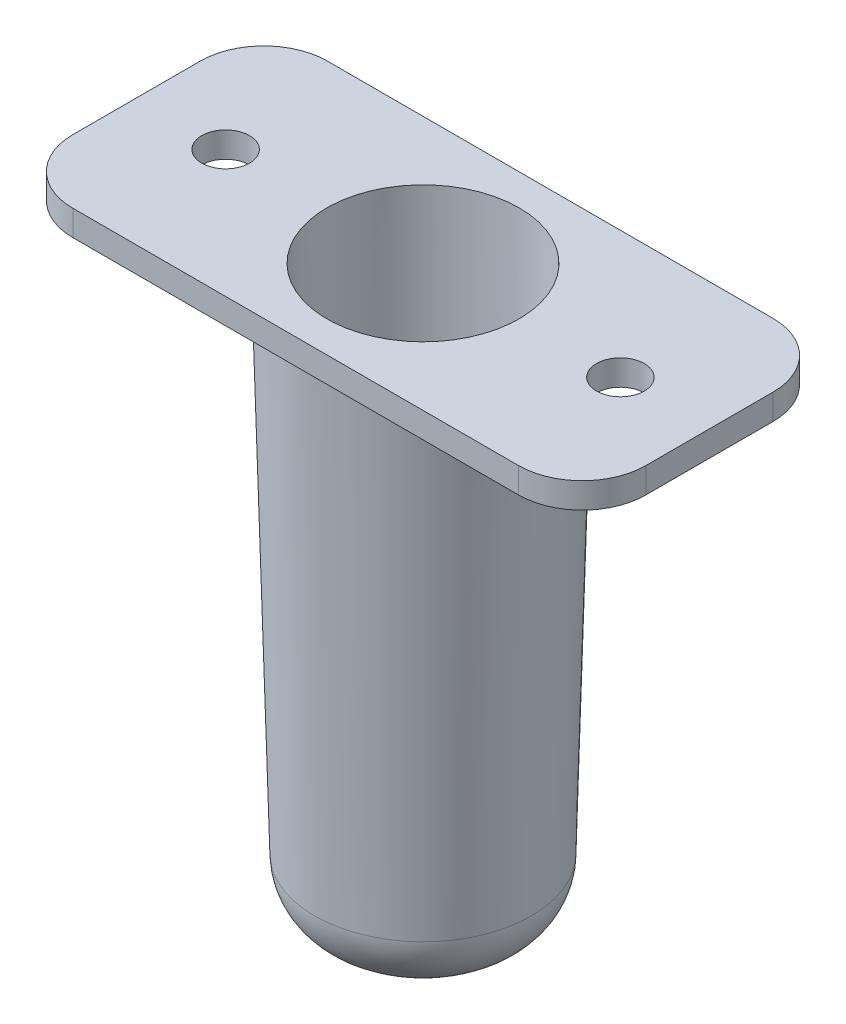
ISO-10303-21;
HEADER;
FILE_DESCRIPTION(('STEP AP214'),'2;1');
FILE_NAME('part.step','',(''),(''),'','','');
FILE_SCHEMA(('AUTOMOTIVE_DESIGN { 1 0 10303 214 1 1 1 1 }'));
ENDSEC;
DATA;
#1=APPLICATION_CONTEXT('core data for automotive mechanical design processes');
#2=APPLICATION_PROTOCOL_DEFINITION('international standard','automotive_design',2000,#1);
#3=PRODUCT_CONTEXT('',#1,'mechanical');
#4=PRODUCT('Part','Part','',(#3));
#5=PRODUCT_RELATED_PRODUCT_CATEGORY('part','',(#4));
#6=PRODUCT_DEFINITION_FORMATION('','',#4);
#7=PRODUCT_DEFINITION_CONTEXT('part definition',#1,'design');
#8=PRODUCT_DEFINITION('design','',#6,#7);
#9=PRODUCT_DEFINITION_SHAPE('','',#8);
#10=(LENGTH_UNIT() NAMED_UNIT(*) SI_UNIT(.MILLI.,.METRE.));
#11=(NAMED_UNIT(*) PLANE_ANGLE_UNIT() SI_UNIT($,.RADIAN.));
#12=(NAMED_UNIT(*) SI_UNIT($,.STERADIAN.) SOLID_ANGLE_UNIT());
#13=UNCERTAINTY_MEASURE_WITH_UNIT(LENGTH_MEASURE(1.E-05),#10,'distance_accuracy_value','');
#14=(GEOMETRIC_REPRESENTATION_CONTEXT(3) GLOBAL_UNCERTAINTY_ASSIGNED_CONTEXT((#13)) GLOBAL_UNIT_ASSIGNED_CONTEXT((#10,
#11,#12)) REPRESENTATION_CONTEXT('',''));
#15=CARTESIAN_POINT('',(0.,0.,0.));
#16=DIRECTION('',(0.,0.,1.));
#17=DIRECTION('',(1.,0.,0.));
#18=AXIS2_PLACEMENT_3D('',#15,#16,#17);
#19=CARTESIAN_POINT('',(22.225,2.54,6.35));
#20=DIRECTION('',(0.,-1.,0.));
#21=DIRECTION('',(0.,0.,-1.));
#22=AXIS2_PLACEMENT_3D('',#19,#20,#21);
#23=CYLINDRICAL_SURFACE('',#22,6.35);
#24=CARTESIAN_POINT('',(22.225,0.,6.35));
#25=DIRECTION('',(0.,1.,0.));
#26=DIRECTION('',(0.,0.,-1.));
#27=AXIS2_PLACEMENT_3D('',#24,#25,#26);
#28=CIRCLE('',#27,6.35);
#29=CARTESIAN_POINT('',(22.225,0.,12.7));
#30=VERTEX_POINT('',#29);
#31=CARTESIAN_POINT('',(28.575,0.,6.34999999999995));
#32=VERTEX_POINT('',#31);
#33=EDGE_CURVE('E132',#30,#32,#28,.T.);
#34=ORIENTED_EDGE('',*,*,#33,.T.);
#35=DIRECTION('',(0.,-1.,0.));
#36=VECTOR('',#35,1.);
#37=CARTESIAN_POINT('',(28.575,2.54,6.34999999999995));
#38=LINE('',#37,#36);
#39=CARTESIAN_POINT('',(28.575,2.54,6.34999999999995));
#40=VERTEX_POINT('',#39);
#41=EDGE_CURVE('E160',#40,#32,#38,.T.);
#42=ORIENTED_EDGE('',*,*,#41,.F.);
#43=CARTESIAN_POINT('',(22.225,2.54,6.35));
#44=DIRECTION('',(0.,1.,0.));
#45=DIRECTION('',(0.,0.,-1.));
#46=AXIS2_PLACEMENT_3D('',#43,#44,#45);
#47=CIRCLE('',#46,6.35);
#48=CARTESIAN_POINT('',(22.225,2.54,12.7));
#49=VERTEX_POINT('',#48);
#50=EDGE_CURVE('E147',#49,#40,#47,.T.);
#51=ORIENTED_EDGE('',*,*,#50,.F.);
#52=DIRECTION('',(0.,-1.,0.));
#53=VECTOR('',#52,1.);
#54=CARTESIAN_POINT('',(22.225,2.54,12.7));
#55=LINE('',#54,#53);
#56=EDGE_CURVE('E128',#49,#30,#55,.T.);
#57=ORIENTED_EDGE('',*,*,#56,.T.);
#58=EDGE_LOOP('',(#34,#42,#51,#57));
#59=FACE_BOUND('',#58,.T.);
#60=ADVANCED_FACE('F34',(#59),#23,.T.);
#61=CARTESIAN_POINT('',(28.575,2.54,6.34999999999995));
#62=DIRECTION('',(-1.,0.,0.));
#63=DIRECTION('',(0.,0.,1.));
#64=AXIS2_PLACEMENT_3D('',#61,#62,#63);
#65=PLANE('',#64);
#66=DIRECTION('',(0.,0.,-1.));
#67=VECTOR('',#66,1.);
#68=CARTESIAN_POINT('',(28.575,0.,6.34999999999995));
#69=LINE('',#68,#67);
#70=CARTESIAN_POINT('',(28.575,0.,-6.34999999999996));
#71=VERTEX_POINT('',#70);
#72=EDGE_CURVE('E135',#32,#71,#69,.T.);
#73=ORIENTED_EDGE('',*,*,#72,.T.);
#74=DIRECTION('',(0.,-1.,0.));
#75=VECTOR('',#74,1.);
#76=CARTESIAN_POINT('',(28.575,2.54,-6.34999999999996));
#77=LINE('',#76,#75);
#78=CARTESIAN_POINT('',(28.575,2.54,-6.34999999999996));
#79=VERTEX_POINT('',#78);
#80=EDGE_CURVE('E157',#79,#71,#77,.T.);
#81=ORIENTED_EDGE('',*,*,#80,.F.);
#82=DIRECTION('',(0.,0.,-1.));
#83=VECTOR('',#82,1.);
#84=CARTESIAN_POINT('',(28.575,2.54,6.34999999999995));
#85=LINE('',#84,#83);
#86=EDGE_CURVE('E95',#40,#79,#85,.T.);
#87=ORIENTED_EDGE('',*,*,#86,.F.);
#88=ORIENTED_EDGE('',*,*,#41,.T.);
#89=EDGE_LOOP('',(#73,#81,#87,#88));
#90=FACE_BOUND('',#89,.T.);
#91=ADVANCED_FACE('F207',(#90),#65,.F.);
#92=CARTESIAN_POINT('',(22.225,2.54,-6.35));
#93=DIRECTION('',(0.,-1.,0.));
#94=DIRECTION('',(0.,0.,-1.));
#95=AXIS2_PLACEMENT_3D('',#92,#93,#94);
#96=CYLINDRICAL_SURFACE('',#95,6.35);
#97=CARTESIAN_POINT('',(22.225,0.,-6.35));
#98=DIRECTION('',(0.,1.,0.));
#99=DIRECTION('',(0.,0.,-1.));
#100=AXIS2_PLACEMENT_3D('',#97,#98,#99);
#101=CIRCLE('',#100,6.35);
#102=CARTESIAN_POINT('',(22.225,0.,-12.7));
#103=VERTEX_POINT('',#102);
#104=EDGE_CURVE('E138',#71,#103,#101,.T.);
#105=ORIENTED_EDGE('',*,*,#104,.T.);
#106=DIRECTION('',(0.,-1.,0.));
#107=VECTOR('',#106,1.);
#108=CARTESIAN_POINT('',(22.225,2.54,-12.7));
#109=LINE('',#108,#107);
#110=CARTESIAN_POINT('',(22.225,2.54,-12.7));
#111=VERTEX_POINT('',#110);
#112=EDGE_CURVE('E154',#111,#103,#109,.T.);
#113=ORIENTED_EDGE('',*,*,#112,.F.);
#114=CARTESIAN_POINT('',(22.225,2.54,-6.35));
#115=DIRECTION('',(0.,1.,0.));
#116=DIRECTION('',(0.,0.,-1.));
#117=AXIS2_PLACEMENT_3D('',#114,#115,#116);
#118=CIRCLE('',#117,6.35);
#119=EDGE_CURVE('E175',#79,#111,#118,.T.);
#120=ORIENTED_EDGE('',*,*,#119,.F.);
#121=ORIENTED_EDGE('',*,*,#80,.T.);
#122=EDGE_LOOP('',(#105,#113,#120,#121));
#123=FACE_BOUND('',#122,.T.);
#124=ADVANCED_FACE('F212',(#123),#96,.T.);
#125=CARTESIAN_POINT('',(-22.225,2.54,-12.7));
#126=DIRECTION('',(0.,0.,1.));
#127=DIRECTION('',(1.,0.,0.));
#128=AXIS2_PLACEMENT_3D('',#125,#126,#127);
#129=PLANE('',#128);
#130=DIRECTION('',(-1.,0.,0.));
#131=VECTOR('',#130,1.);
#132=CARTESIAN_POINT('',(-22.225,0.,-12.7));
#133=LINE('',#132,#131);
#134=CARTESIAN_POINT('',(-22.225,0.,-12.7));
#135=VERTEX_POINT('',#134);
#136=EDGE_CURVE('E140',#103,#135,#133,.T.);
#137=ORIENTED_EDGE('',*,*,#136,.T.);
#138=DIRECTION('',(0.,-1.,0.));
#139=VECTOR('',#138,1.);
#140=CARTESIAN_POINT('',(-22.225,2.54,-12.7));
#141=LINE('',#140,#139);
#142=CARTESIAN_POINT('',(-22.225,2.54,-12.7));
#143=VERTEX_POINT('',#142);
#144=EDGE_CURVE('E151',#143,#135,#141,.T.);
#145=ORIENTED_EDGE('',*,*,#144,.F.);
#146=DIRECTION('',(-1.,0.,0.));
#147=VECTOR('',#146,1.);
#148=CARTESIAN_POINT('',(-22.225,2.54,-12.7));
#149=LINE('',#148,#147);
#150=EDGE_CURVE('E177',#111,#143,#149,.T.);
#151=ORIENTED_EDGE('',*,*,#150,.F.);
#152=ORIENTED_EDGE('',*,*,#112,.T.);
#153=EDGE_LOOP('',(#137,#145,#151,#152));
#154=FACE_BOUND('',#153,.T.);
#155=ADVANCED_FACE('F183',(#154),#129,.F.);
#156=CARTESIAN_POINT('',(-22.225,2.54,-6.35));
#157=DIRECTION('',(0.,-1.,0.));
#158=DIRECTION('',(0.,0.,-1.));
#159=AXIS2_PLACEMENT_3D('',#156,#157,#158);
#160=CYLINDRICAL_SURFACE('',#159,6.35);
#161=CARTESIAN_POINT('',(-22.225,0.,-6.35));
#162=DIRECTION('',(0.,1.,0.));
#163=DIRECTION('',(0.,0.,1.));
#164=AXIS2_PLACEMENT_3D('',#161,#162,#163);
#165=CIRCLE('',#164,6.35);
#166=CARTESIAN_POINT('',(-28.575,0.,-6.34999999999996));
#167=VERTEX_POINT('',#166);
#168=EDGE_CURVE('E142',#135,#167,#165,.T.);
#169=ORIENTED_EDGE('',*,*,#168,.T.);
#170=DIRECTION('',(0.,-1.,0.));
#171=VECTOR('',#170,1.);
#172=CARTESIAN_POINT('',(-28.575,2.54,-6.34999999999996));
#173=LINE('',#172,#171);
#174=CARTESIAN_POINT('',(-28.575,2.54,-6.34999999999996));
#175=VERTEX_POINT('',#174);
#176=EDGE_CURVE('E123',#175,#167,#173,.T.);
#177=ORIENTED_EDGE('',*,*,#176,.F.);
#178=CARTESIAN_POINT('',(-22.225,2.54,-6.35));
#179=DIRECTION('',(0.,1.,0.));
#180=DIRECTION('',(0.,0.,1.));
#181=AXIS2_PLACEMENT_3D('',#178,#179,#180);
#182=CIRCLE('',#181,6.35);
#183=EDGE_CURVE('E114',#143,#175,#182,.T.);
#184=ORIENTED_EDGE('',*,*,#183,.F.);
#185=ORIENTED_EDGE('',*,*,#144,.T.);
#186=EDGE_LOOP('',(#169,#177,#184,#185));
#187=FACE_BOUND('',#186,.T.);
#188=ADVANCED_FACE('F187',(#187),#160,.T.);
#189=CARTESIAN_POINT('',(-28.575,2.54,6.34999999999995));
#190=DIRECTION('',(1.,0.,0.));
#191=DIRECTION('',(0.,0.,-1.));
#192=AXIS2_PLACEMENT_3D('',#189,#190,#191);
#193=PLANE('',#192);
#194=DIRECTION('',(0.,0.,1.));
#195=VECTOR('',#194,1.);
#196=CARTESIAN_POINT('',(-28.575,0.,6.34999999999995));
#197=LINE('',#196,#195);
#198=CARTESIAN_POINT('',(-28.575,0.,6.34999999999995));
#199=VERTEX_POINT('',#198);
#200=EDGE_CURVE('E122',#167,#199,#197,.T.);
#201=ORIENTED_EDGE('',*,*,#200,.T.);
#202=DIRECTION('',(0.,-1.,0.));
#203=VECTOR('',#202,1.);
#204=CARTESIAN_POINT('',(-28.575,2.54,6.34999999999995));
#205=LINE('',#204,#203);
#206=CARTESIAN_POINT('',(-28.575,2.54,6.34999999999995));
#207=VERTEX_POINT('',#206);
#208=EDGE_CURVE('E119',#207,#199,#205,.T.);
#209=ORIENTED_EDGE('',*,*,#208,.F.);
#210=DIRECTION('',(0.,0.,1.));
#211=VECTOR('',#210,1.);
#212=CARTESIAN_POINT('',(-28.575,2.54,6.34999999999995));
#213=LINE('',#212,#211);
#214=EDGE_CURVE('E108',#175,#207,#213,.T.);
#215=ORIENTED_EDGE('',*,*,#214,.F.);
#216=ORIENTED_EDGE('',*,*,#176,.T.);
#217=EDGE_LOOP('',(#201,#209,#215,#216));
#218=FACE_BOUND('',#217,.T.);
#219=ADVANCED_FACE('F120',(#218),#193,.F.);
#220=CARTESIAN_POINT('',(-22.225,2.54,6.35));
#221=DIRECTION('',(0.,-1.,0.));
#222=DIRECTION('',(0.,0.,-1.));
#223=AXIS2_PLACEMENT_3D('',#220,#221,#222);
#224=CYLINDRICAL_SURFACE('',#223,6.35);
#225=CARTESIAN_POINT('',(-22.225,0.,6.35));
#226=DIRECTION('',(0.,1.,0.));
#227=DIRECTION('',(0.,0.,1.));
#228=AXIS2_PLACEMENT_3D('',#225,#226,#227);
#229=CIRCLE('',#228,6.35);
#230=CARTESIAN_POINT('',(-22.225,0.,12.7));
#231=VERTEX_POINT('',#230);
#232=EDGE_CURVE('E80',#199,#231,#229,.T.);
#233=ORIENTED_EDGE('',*,*,#232,.T.);
#234=DIRECTION('',(0.,-1.,0.));
#235=VECTOR('',#234,1.);
#236=CARTESIAN_POINT('',(-22.225,2.54,12.7));
#237=LINE('',#236,#235);
#238=CARTESIAN_POINT('',(-22.225,2.54,12.7));
#239=VERTEX_POINT('',#238);
#240=EDGE_CURVE('E124',#239,#231,#237,.T.);
#241=ORIENTED_EDGE('',*,*,#240,.F.);
#242=CARTESIAN_POINT('',(-22.225,2.54,6.35));
#243=DIRECTION('',(0.,1.,0.));
#244=DIRECTION('',(0.,0.,1.));
#245=AXIS2_PLACEMENT_3D('',#242,#243,#244);
#246=CIRCLE('',#245,6.35);
#247=EDGE_CURVE('E112',#207,#239,#246,.T.);
#248=ORIENTED_EDGE('',*,*,#247,.F.);
#249=ORIENTED_EDGE('',*,*,#208,.T.);
#250=EDGE_LOOP('',(#233,#241,#248,#249));
#251=FACE_BOUND('',#250,.T.);
#252=ADVANCED_FACE('F126',(#251),#224,.T.);
#253=CARTESIAN_POINT('',(-22.225,2.54,12.7));
#254=DIRECTION('',(0.,0.,-1.));
#255=DIRECTION('',(-1.,0.,0.));
#256=AXIS2_PLACEMENT_3D('',#253,#254,#255);
#257=PLANE('',#256);
#258=DIRECTION('',(1.,0.,0.));
#259=VECTOR('',#258,1.);
#260=CARTESIAN_POINT('',(-22.225,0.,12.7));
#261=LINE('',#260,#259);
#262=EDGE_CURVE('E86',#231,#30,#261,.T.);
#263=ORIENTED_EDGE('',*,*,#262,.T.);
#264=ORIENTED_EDGE('',*,*,#56,.F.);
#265=DIRECTION('',(1.,0.,0.));
#266=VECTOR('',#265,1.);
#267=CARTESIAN_POINT('',(-22.225,2.54,12.7));
#268=LINE('',#267,#266);
#269=EDGE_CURVE('E51',#239,#49,#268,.T.);
#270=ORIENTED_EDGE('',*,*,#269,.F.);
#271=ORIENTED_EDGE('',*,*,#240,.T.);
#272=EDGE_LOOP('',(#263,#264,#270,#271));
#273=FACE_BOUND('',#272,.T.);
#274=ADVANCED_FACE('F195',(#273),#257,.F.);
#275=CARTESIAN_POINT('',(22.225,2.54,6.35));
#276=DIRECTION('',(0.,-1.,0.));
#277=DIRECTION('',(0.,0.,-1.));
#278=AXIS2_PLACEMENT_3D('',#275,#276,#277);
#279=PLANE('',#278);
#280=CARTESIAN_POINT('',(-19.685,2.54,0.));
#281=DIRECTION('',(0.,-1.,0.));
#282=DIRECTION('',(0.,0.,-1.));
#283=AXIS2_PLACEMENT_3D('',#280,#281,#282);
#284=CIRCLE('',#283,2.38125);
#285=CARTESIAN_POINT('',(-19.685,2.54,-2.38125));
#286=VERTEX_POINT('',#285);
#287=EDGE_CURVE('E272',#286,#286,#284,.T.);
#288=ORIENTED_EDGE('',*,*,#287,.T.);
#289=EDGE_LOOP('',(#288));
#290=FACE_BOUND('',#289,.T.);
#291=CARTESIAN_POINT('',(19.685,2.54,0.));
#292=DIRECTION('',(0.,-1.,0.));
#293=DIRECTION('',(0.,0.,-1.));
#294=AXIS2_PLACEMENT_3D('',#291,#292,#293);
#295=CIRCLE('',#294,2.38125);
#296=CARTESIAN_POINT('',(19.685,2.54,-2.38125));
#297=VERTEX_POINT('',#296);
#298=EDGE_CURVE('E261',#297,#297,#295,.F.);
#299=ORIENTED_EDGE('',*,*,#298,.F.);
#300=EDGE_LOOP('',(#299));
#301=FACE_BOUND('',#300,.T.);
#302=CARTESIAN_POINT('',(0.,2.54,0.));
#303=DIRECTION('',(0.,-1.,0.));
#304=DIRECTION('',(0.,0.,-1.));
#305=AXIS2_PLACEMENT_3D('',#302,#303,#304);
#306=CIRCLE('',#305,9.59064154785893);
#307=CARTESIAN_POINT('',(0.,2.54,-9.59064154785893));
#308=VERTEX_POINT('',#307);
#309=EDGE_CURVE('E259',#308,#308,#306,.T.);
#310=ORIENTED_EDGE('',*,*,#309,.T.);
#311=EDGE_LOOP('',(#310));
#312=FACE_BOUND('',#311,.T.);
#313=ORIENTED_EDGE('',*,*,#50,.T.);
#314=ORIENTED_EDGE('',*,*,#86,.T.);
#315=ORIENTED_EDGE('',*,*,#119,.T.);
#316=ORIENTED_EDGE('',*,*,#150,.T.);
#317=ORIENTED_EDGE('',*,*,#183,.T.);
#318=ORIENTED_EDGE('',*,*,#214,.T.);
#319=ORIENTED_EDGE('',*,*,#247,.T.);
#320=ORIENTED_EDGE('',*,*,#269,.T.);
#321=EDGE_LOOP('',(#313,#314,#315,#316,#317,#318,#319,#320));
#322=FACE_BOUND('',#321,.T.);
#323=ADVANCED_FACE('F110',(#290,#301,#312,#322),#279,.F.);
#324=CARTESIAN_POINT('',(22.225,0.,6.35));
#325=DIRECTION('',(0.,-1.,0.));
#326=DIRECTION('',(0.,0.,-1.));
#327=AXIS2_PLACEMENT_3D('',#324,#325,#326);
#328=PLANE('',#327);
#329=CARTESIAN_POINT('',(-19.685,0.,0.));
#330=DIRECTION('',(0.,1.,0.));
#331=DIRECTION('',(0.,0.,-1.));
#332=AXIS2_PLACEMENT_3D('',#329,#330,#331);
#333=CIRCLE('',#332,2.38125);
#334=CARTESIAN_POINT('',(-19.685,0.,-2.38125));
#335=VERTEX_POINT('',#334);
#336=EDGE_CURVE('E271',#335,#335,#333,.T.);
#337=ORIENTED_EDGE('',*,*,#336,.T.);
#338=EDGE_LOOP('',(#337));
#339=FACE_BOUND('',#338,.T.);
#340=CARTESIAN_POINT('',(19.685,0.,0.));
#341=DIRECTION('',(0.,-1.,0.));
#342=DIRECTION('',(0.,0.,-1.));
#343=AXIS2_PLACEMENT_3D('',#340,#341,#342);
#344=CIRCLE('',#343,2.38125);
#345=CARTESIAN_POINT('',(19.685,0.,-2.38125));
#346=VERTEX_POINT('',#345);
#347=EDGE_CURVE('E266',#346,#346,#344,.T.);
#348=ORIENTED_EDGE('',*,*,#347,.F.);
#349=EDGE_LOOP('',(#348));
#350=FACE_BOUND('',#349,.T.);
#351=CARTESIAN_POINT('',(0.,0.,0.));
#352=DIRECTION('',(0.,-1.,0.));
#353=DIRECTION('',(0.,0.,-1.));
#354=AXIS2_PLACEMENT_3D('',#351,#352,#353);
#355=CIRCLE('',#354,12.065);
#356=CARTESIAN_POINT('',(0.,0.,-12.065));
#357=VERTEX_POINT('',#356);
#358=EDGE_CURVE('E161',#357,#357,#355,.T.);
#359=ORIENTED_EDGE('',*,*,#358,.F.);
#360=EDGE_LOOP('',(#359));
#361=FACE_BOUND('',#360,.T.);
#362=ORIENTED_EDGE('',*,*,#33,.F.);
#363=ORIENTED_EDGE('',*,*,#262,.F.);
#364=ORIENTED_EDGE('',*,*,#232,.F.);
#365=ORIENTED_EDGE('',*,*,#200,.F.);
#366=ORIENTED_EDGE('',*,*,#168,.F.);
#367=ORIENTED_EDGE('',*,*,#136,.F.);
#368=ORIENTED_EDGE('',*,*,#104,.F.);
#369=ORIENTED_EDGE('',*,*,#72,.F.);
#370=EDGE_LOOP('',(#362,#363,#364,#365,#366,#367,#368,#369));
#371=FACE_BOUND('',#370,.T.);
#372=ADVANCED_FACE('F190',(#339,#350,#361,#371),#328,.T.);
#373=CARTESIAN_POINT('',(0.,0.,0.));
#374=DIRECTION('',(0.,1.,0.));
#375=DIRECTION('',(0.,0.,-1.));
#376=AXIS2_PLACEMENT_3D('',#373,#374,#375);
#377=CONICAL_SURFACE('',#376,12.065,0.026179938779915);
#378=CARTESIAN_POINT('',(0.,-48.426223621755,0.));
#379=DIRECTION('',(0.,1.,0.));
#380=DIRECTION('',(0.,0.,1.));
#381=AXIS2_PLACEMENT_3D('',#378,#379,#380);
#382=CIRCLE('',#381,10.7969147063488);
#383=CARTESIAN_POINT('',(0.,-48.426223621755,10.7969147063488));
#384=VERTEX_POINT('',#383);
#385=EDGE_CURVE('E11',#384,#384,#382,.T.);
#386=ORIENTED_EDGE('',*,*,#385,.T.);
#387=EDGE_LOOP('',(#386));
#388=FACE_BOUND('',#387,.T.);
#389=ORIENTED_EDGE('',*,*,#358,.T.);
#390=EDGE_LOOP('',(#389));
#391=FACE_BOUND('',#390,.T.);
#392=ADVANCED_FACE('F215',(#388,#391),#377,.T.);
#393=CARTESIAN_POINT('',(0.,-54.61,0.));
#394=DIRECTION('',(0.,-1.,0.));
#395=DIRECTION('',(0.,0.,-1.));
#396=AXIS2_PLACEMENT_3D('',#393,#394,#395);
#397=PLANE('',#396);
#398=CARTESIAN_POINT('',(0.,-54.61,0.));
#399=DIRECTION('',(0.,-1.,0.));
#400=DIRECTION('',(0.,0.,-1.));
#401=AXIS2_PLACEMENT_3D('',#398,#399,#400);
#402=CIRCLE('',#401,4.44909069275402);
#403=CARTESIAN_POINT('',(0.,-54.61,-4.44909069275402));
#404=VERTEX_POINT('',#403);
#405=EDGE_CURVE('E43',#404,#404,#402,.T.);
#406=ORIENTED_EDGE('',*,*,#405,.T.);
#407=EDGE_LOOP('',(#406));
#408=FACE_BOUND('',#407,.T.);
#409=ADVANCED_FACE('F217',(#408),#397,.T.);
#410=CARTESIAN_POINT('',(0.,-48.26,0.));
#411=DIRECTION('',(0.,-1.,0.));
#412=DIRECTION('',(0.,0.,-1.));
#413=AXIS2_PLACEMENT_3D('',#410,#411,#412);
#414=DEGENERATE_TOROIDAL_SURFACE('',#413,4.44909069275402,6.35,.T.);
#415=ORIENTED_EDGE('',*,*,#385,.F.);
#416=EDGE_LOOP('',(#415));
#417=FACE_BOUND('',#416,.T.);
#418=ORIENTED_EDGE('',*,*,#405,.F.);
#419=EDGE_LOOP('',(#418));
#420=FACE_BOUND('',#419,.T.);
#421=ADVANCED_FACE('F36',(#417,#420),#414,.T.);
#422=CARTESIAN_POINT('',(0.,0.066489448701998,0.));
#423=DIRECTION('',(0.,1.,0.));
#424=DIRECTION('',(0.,0.,-1.));
#425=AXIS2_PLACEMENT_3D('',#422,#423,#424);
#426=CONICAL_SURFACE('',#425,9.52587039456208,0.026179938779915);
#427=CARTESIAN_POINT('',(0.,-48.359734173053,0.));
#428=DIRECTION('',(0.,1.,0.));
#429=DIRECTION('',(0.,0.,1.));
#430=AXIS2_PLACEMENT_3D('',#427,#428,#429);
#431=CIRCLE('',#430,8.2577851009109);
#432=CARTESIAN_POINT('',(0.,-48.359734173053,8.2577851009109));
#433=VERTEX_POINT('',#432);
#434=EDGE_CURVE('E136',#433,#433,#431,.T.);
#435=ORIENTED_EDGE('',*,*,#434,.F.);
#436=EDGE_LOOP('',(#435));
#437=FACE_BOUND('',#436,.T.);
#438=ORIENTED_EDGE('',*,*,#309,.F.);
#439=EDGE_LOOP('',(#438));
#440=FACE_BOUND('',#439,.T.);
#441=ADVANCED_FACE('F229',(#437,#440),#426,.F.);
#442=CARTESIAN_POINT('',(0.,-52.07,0.));
#443=DIRECTION('',(0.,-1.,0.));
#444=DIRECTION('',(0.,0.,-1.));
#445=AXIS2_PLACEMENT_3D('',#442,#443,#444);
#446=PLANE('',#445);
#447=CARTESIAN_POINT('',(0.,-52.07,0.));
#448=DIRECTION('',(0.,-1.,0.));
#449=DIRECTION('',(0.,0.,-1.));
#450=AXIS2_PLACEMENT_3D('',#447,#448,#449);
#451=CIRCLE('',#450,4.44909069275402);
#452=CARTESIAN_POINT('',(0.,-52.07,-4.44909069275402));
#453=VERTEX_POINT('',#452);
#454=EDGE_CURVE('E171',#453,#453,#451,.T.);
#455=ORIENTED_EDGE('',*,*,#454,.F.);
#456=EDGE_LOOP('',(#455));
#457=FACE_BOUND('',#456,.T.);
#458=ADVANCED_FACE('F233',(#457),#446,.F.);
#459=CARTESIAN_POINT('',(0.,-48.26,0.));
#460=DIRECTION('',(0.,-1.,0.));
#461=DIRECTION('',(0.,0.,-1.));
#462=AXIS2_PLACEMENT_3D('',#459,#460,#461);
#463=TOROIDAL_SURFACE('',#462,4.44909069275402,3.81);
#464=ORIENTED_EDGE('',*,*,#434,.T.);
#465=EDGE_LOOP('',(#464));
#466=FACE_BOUND('',#465,.T.);
#467=ORIENTED_EDGE('',*,*,#454,.T.);
#468=EDGE_LOOP('',(#467));
#469=FACE_BOUND('',#468,.T.);
#470=ADVANCED_FACE('F239',(#466,#469),#463,.F.);
#471=CARTESIAN_POINT('',(19.685,2.541,0.));
#472=DIRECTION('',(0.,-1.,0.));
#473=DIRECTION('',(0.,0.,-1.));
#474=AXIS2_PLACEMENT_3D('',#471,#472,#473);
#475=CYLINDRICAL_SURFACE('',#474,2.38125);
#476=ORIENTED_EDGE('',*,*,#347,.T.);
#477=EDGE_LOOP('',(#476));
#478=FACE_BOUND('',#477,.T.);
#479=ORIENTED_EDGE('',*,*,#298,.T.);
#480=EDGE_LOOP('',(#479));
#481=FACE_BOUND('',#480,.T.);
#482=ADVANCED_FACE('F245',(#478,#481),#475,.F.);
#483=CARTESIAN_POINT('',(-19.685,2.541,0.));
#484=DIRECTION('',(0.,-1.,0.));
#485=DIRECTION('',(0.,0.,-1.));
#486=AXIS2_PLACEMENT_3D('',#483,#484,#485);
#487=CYLINDRICAL_SURFACE('',#486,2.38125);
#488=ORIENTED_EDGE('',*,*,#336,.F.);
#489=EDGE_LOOP('',(#488));
#490=FACE_BOUND('',#489,.T.);
#491=ORIENTED_EDGE('',*,*,#287,.F.);
#492=EDGE_LOOP('',(#491));
#493=FACE_BOUND('',#492,.T.);
#494=ADVANCED_FACE('F253',(#490,#493),#487,.F.);
#495=CLOSED_SHELL('',(#60,#91,#124,#155,#188,#219,#252,#274,#323,#372,#392,#409,#421,#441,#458,
#470,#482,#494));
#496=MANIFOLD_SOLID_BREP('B2',#495);
#497=ADVANCED_BREP_SHAPE_REPRESENTATION('',(#18,#496),#14);
#498=SHAPE_DEFINITION_REPRESENTATION(#9,#497);
ENDSEC;
END-ISO-10303-21;
